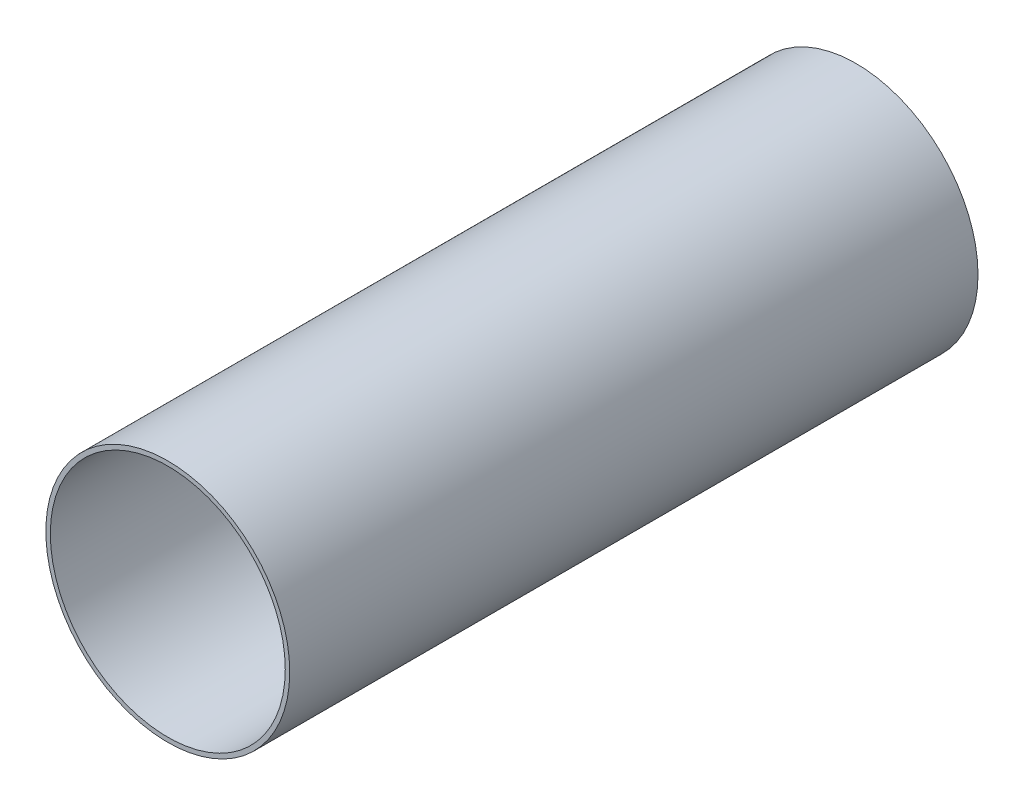
ISO-10303-21;
HEADER;
FILE_DESCRIPTION(('STEP AP214'),'2;1');
FILE_NAME('part.step','',(''),(''),'','','');
FILE_SCHEMA(('AUTOMOTIVE_DESIGN { 1 0 10303 214 1 1 1 1 }'));
ENDSEC;
DATA;
#1=APPLICATION_CONTEXT('core data for automotive mechanical design processes');
#2=APPLICATION_PROTOCOL_DEFINITION('international standard','automotive_design',2000,#1);
#3=PRODUCT_CONTEXT('',#1,'mechanical');
#4=PRODUCT('Part','Part','',(#3));
#5=PRODUCT_RELATED_PRODUCT_CATEGORY('part','',(#4));
#6=PRODUCT_DEFINITION_FORMATION('','',#4);
#7=PRODUCT_DEFINITION_CONTEXT('part definition',#1,'design');
#8=PRODUCT_DEFINITION('design','',#6,#7);
#9=PRODUCT_DEFINITION_SHAPE('','',#8);
#10=(LENGTH_UNIT() NAMED_UNIT(*) SI_UNIT(.MILLI.,.METRE.));
#11=(NAMED_UNIT(*) PLANE_ANGLE_UNIT() SI_UNIT($,.RADIAN.));
#12=(NAMED_UNIT(*) SI_UNIT($,.STERADIAN.) SOLID_ANGLE_UNIT());
#13=UNCERTAINTY_MEASURE_WITH_UNIT(LENGTH_MEASURE(1.E-05),#10,'distance_accuracy_value','');
#14=(GEOMETRIC_REPRESENTATION_CONTEXT(3) GLOBAL_UNCERTAINTY_ASSIGNED_CONTEXT((#13)) GLOBAL_UNIT_ASSIGNED_CONTEXT((#10,
#11,#12)) REPRESENTATION_CONTEXT('',''));
#15=CARTESIAN_POINT('',(0.,0.,0.));
#16=DIRECTION('',(0.,0.,1.));
#17=DIRECTION('',(1.,0.,0.));
#18=AXIS2_PLACEMENT_3D('',#15,#16,#17);
#19=CARTESIAN_POINT('',(0.,0.,279.4));
#20=DIRECTION('',(0.,0.,1.));
#21=DIRECTION('',(1.,0.,0.));
#22=AXIS2_PLACEMENT_3D('',#19,#20,#21);
#23=PLANE('',#22);
#24=CARTESIAN_POINT('',(0.,0.,279.4));
#25=DIRECTION('',(0.,0.,1.));
#26=DIRECTION('',(1.,0.,0.));
#27=AXIS2_PLACEMENT_3D('',#24,#25,#26);
#28=CIRCLE('',#27,49.5046);
#29=CARTESIAN_POINT('',(49.5046,0.,279.4));
#30=VERTEX_POINT('',#29);
#31=EDGE_CURVE('E10',#30,#30,#28,.T.);
#32=ORIENTED_EDGE('',*,*,#31,.T.);
#33=EDGE_LOOP('',(#32));
#34=FACE_BOUND('',#33,.T.);
#35=CARTESIAN_POINT('',(0.,0.,279.4));
#36=DIRECTION('',(0.,0.,1.));
#37=DIRECTION('',(1.,0.,0.));
#38=AXIS2_PLACEMENT_3D('',#35,#36,#37);
#39=CIRCLE('',#38,47.6885);
#40=CARTESIAN_POINT('',(47.6885,0.,279.4));
#41=VERTEX_POINT('',#40);
#42=EDGE_CURVE('E48',#41,#41,#39,.T.);
#43=ORIENTED_EDGE('',*,*,#42,.F.);
#44=EDGE_LOOP('',(#43));
#45=FACE_BOUND('',#44,.T.);
#46=ADVANCED_FACE('F37',(#34,#45),#23,.T.);
#47=CARTESIAN_POINT('',(0.,0.,0.));
#48=DIRECTION('',(0.,0.,1.));
#49=DIRECTION('',(1.,0.,0.));
#50=AXIS2_PLACEMENT_3D('',#47,#48,#49);
#51=PLANE('',#50);
#52=CARTESIAN_POINT('',(0.,0.,0.));
#53=DIRECTION('',(0.,0.,1.));
#54=DIRECTION('',(1.,0.,0.));
#55=AXIS2_PLACEMENT_3D('',#52,#53,#54);
#56=CIRCLE('',#55,49.5046);
#57=CARTESIAN_POINT('',(49.5046,0.,0.));
#58=VERTEX_POINT('',#57);
#59=EDGE_CURVE('E41',#58,#58,#56,.T.);
#60=ORIENTED_EDGE('',*,*,#59,.F.);
#61=EDGE_LOOP('',(#60));
#62=FACE_BOUND('',#61,.T.);
#63=CARTESIAN_POINT('',(0.,0.,0.));
#64=DIRECTION('',(0.,0.,1.));
#65=DIRECTION('',(1.,0.,0.));
#66=AXIS2_PLACEMENT_3D('',#63,#64,#65);
#67=CIRCLE('',#66,47.6885);
#68=CARTESIAN_POINT('',(47.6885,0.,0.));
#69=VERTEX_POINT('',#68);
#70=EDGE_CURVE('E50',#69,#69,#67,.T.);
#71=ORIENTED_EDGE('',*,*,#70,.T.);
#72=EDGE_LOOP('',(#71));
#73=FACE_BOUND('',#72,.T.);
#74=ADVANCED_FACE('F60',(#62,#73),#51,.F.);
#75=CARTESIAN_POINT('',(0.,0.,279.4));
#76=DIRECTION('',(0.,0.,-1.));
#77=DIRECTION('',(-1.,0.,0.));
#78=AXIS2_PLACEMENT_3D('',#75,#76,#77);
#79=CYLINDRICAL_SURFACE('',#78,49.5046);
#80=ORIENTED_EDGE('',*,*,#31,.F.);
#81=EDGE_LOOP('',(#80));
#82=FACE_BOUND('',#81,.T.);
#83=ORIENTED_EDGE('',*,*,#59,.T.);
#84=EDGE_LOOP('',(#83));
#85=FACE_BOUND('',#84,.T.);
#86=ADVANCED_FACE('F39',(#82,#85),#79,.T.);
#87=CARTESIAN_POINT('',(0.,0.,279.4));
#88=DIRECTION('',(0.,0.,-1.));
#89=DIRECTION('',(-1.,0.,0.));
#90=AXIS2_PLACEMENT_3D('',#87,#88,#89);
#91=CYLINDRICAL_SURFACE('',#90,47.6885);
#92=ORIENTED_EDGE('',*,*,#42,.T.);
#93=EDGE_LOOP('',(#92));
#94=FACE_BOUND('',#93,.T.);
#95=ORIENTED_EDGE('',*,*,#70,.F.);
#96=EDGE_LOOP('',(#95));
#97=FACE_BOUND('',#96,.T.);
#98=ADVANCED_FACE('F56',(#94,#97),#91,.F.);
#99=CLOSED_SHELL('',(#46,#74,#86,#98));
#100=MANIFOLD_SOLID_BREP('B2',#99);
#101=ADVANCED_BREP_SHAPE_REPRESENTATION('',(#18,#100),#14);
#102=SHAPE_DEFINITION_REPRESENTATION(#9,#101);
ENDSEC;
END-ISO-10303-21;
